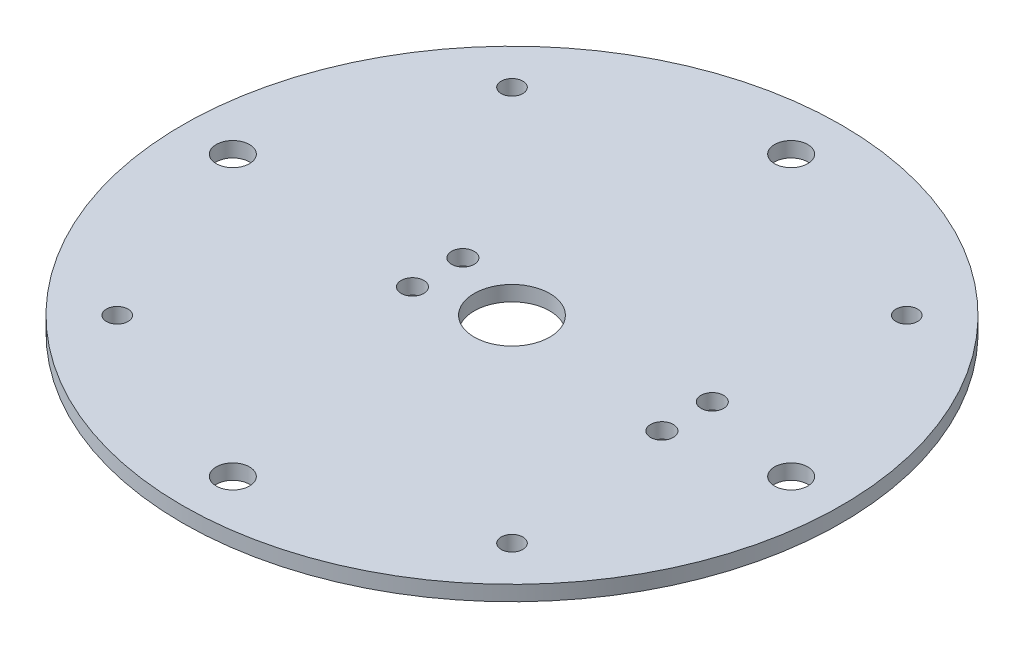
ISO-10303-21;
HEADER;
FILE_DESCRIPTION(('STEP AP214'),'2;1');
FILE_NAME('part.step','',(''),(''),'','','');
FILE_SCHEMA(('AUTOMOTIVE_DESIGN { 1 0 10303 214 1 1 1 1 }'));
ENDSEC;
DATA;
#1=APPLICATION_CONTEXT('core data for automotive mechanical design processes');
#2=APPLICATION_PROTOCOL_DEFINITION('international standard','automotive_design',2000,#1);
#3=PRODUCT_CONTEXT('',#1,'mechanical');
#4=PRODUCT('Part','Part','',(#3));
#5=PRODUCT_RELATED_PRODUCT_CATEGORY('part','',(#4));
#6=PRODUCT_DEFINITION_FORMATION('','',#4);
#7=PRODUCT_DEFINITION_CONTEXT('part definition',#1,'design');
#8=PRODUCT_DEFINITION('design','',#6,#7);
#9=PRODUCT_DEFINITION_SHAPE('','',#8);
#10=(LENGTH_UNIT() NAMED_UNIT(*) SI_UNIT(.MILLI.,.METRE.));
#11=(NAMED_UNIT(*) PLANE_ANGLE_UNIT() SI_UNIT($,.RADIAN.));
#12=(NAMED_UNIT(*) SI_UNIT($,.STERADIAN.) SOLID_ANGLE_UNIT());
#13=UNCERTAINTY_MEASURE_WITH_UNIT(LENGTH_MEASURE(1.E-05),#10,'distance_accuracy_value','');
#14=(GEOMETRIC_REPRESENTATION_CONTEXT(3) GLOBAL_UNCERTAINTY_ASSIGNED_CONTEXT((#13)) GLOBAL_UNIT_ASSIGNED_CONTEXT((#10,
#11,#12)) REPRESENTATION_CONTEXT('',''));
#15=CARTESIAN_POINT('',(0.,0.,0.));
#16=DIRECTION('',(0.,0.,1.));
#17=DIRECTION('',(1.,0.,0.));
#18=AXIS2_PLACEMENT_3D('',#15,#16,#17);
#19=CARTESIAN_POINT('',(0.,1.5,0.));
#20=DIRECTION('',(0.,-1.,0.));
#21=DIRECTION('',(0.,0.,-1.));
#22=AXIS2_PLACEMENT_3D('',#19,#20,#21);
#23=CYLINDRICAL_SURFACE('',#22,65.4);
#24=CARTESIAN_POINT('',(0.,1.5,0.));
#25=DIRECTION('',(0.,1.,0.));
#26=DIRECTION('',(0.,0.,1.));
#27=AXIS2_PLACEMENT_3D('',#24,#25,#26);
#28=CIRCLE('',#27,65.4);
#29=CARTESIAN_POINT('',(0.,1.5,65.4));
#30=VERTEX_POINT('',#29);
#31=EDGE_CURVE('E10',#30,#30,#28,.T.);
#32=ORIENTED_EDGE('',*,*,#31,.F.);
#33=EDGE_LOOP('',(#32));
#34=FACE_BOUND('',#33,.T.);
#35=CARTESIAN_POINT('',(0.,-1.5,0.));
#36=DIRECTION('',(0.,1.,0.));
#37=DIRECTION('',(0.,0.,1.));
#38=AXIS2_PLACEMENT_3D('',#35,#36,#37);
#39=CIRCLE('',#38,65.4);
#40=CARTESIAN_POINT('',(0.,-1.5,65.4));
#41=VERTEX_POINT('',#40);
#42=EDGE_CURVE('E37',#41,#41,#39,.T.);
#43=ORIENTED_EDGE('',*,*,#42,.T.);
#44=EDGE_LOOP('',(#43));
#45=FACE_BOUND('',#44,.T.);
#46=ADVANCED_FACE('F34',(#34,#45),#23,.T.);
#47=CARTESIAN_POINT('',(0.,1.5,0.));
#48=DIRECTION('',(0.,1.,0.));
#49=DIRECTION('',(0.,0.,1.));
#50=AXIS2_PLACEMENT_3D('',#47,#48,#49);
#51=PLANE('',#50);
#52=CARTESIAN_POINT('',(-14.75,1.5,5.00000000000002));
#53=DIRECTION('',(0.,-1.,0.));
#54=DIRECTION('',(0.,0.,-1.));
#55=AXIS2_PLACEMENT_3D('',#52,#53,#54);
#56=CIRCLE('',#55,2.25);
#57=CARTESIAN_POINT('',(-14.75,1.5,2.75000000000003));
#58=VERTEX_POINT('',#57);
#59=EDGE_CURVE('E113',#58,#58,#56,.T.);
#60=ORIENTED_EDGE('',*,*,#59,.T.);
#61=EDGE_LOOP('',(#60));
#62=FACE_BOUND('',#61,.T.);
#63=CARTESIAN_POINT('',(34.75,1.5,-4.99999999999999));
#64=DIRECTION('',(0.,-1.,0.));
#65=DIRECTION('',(0.,0.,-1.));
#66=AXIS2_PLACEMENT_3D('',#63,#64,#65);
#67=CIRCLE('',#66,2.25000000000001);
#68=CARTESIAN_POINT('',(34.75,1.5,-7.25));
#69=VERTEX_POINT('',#68);
#70=EDGE_CURVE('E106',#69,#69,#67,.T.);
#71=ORIENTED_EDGE('',*,*,#70,.T.);
#72=EDGE_LOOP('',(#71));
#73=FACE_BOUND('',#72,.T.);
#74=CARTESIAN_POINT('',(34.75,1.5,5.00000000000002));
#75=DIRECTION('',(0.,-1.,0.));
#76=DIRECTION('',(0.,0.,-1.));
#77=AXIS2_PLACEMENT_3D('',#74,#75,#76);
#78=CIRCLE('',#77,2.25);
#79=CARTESIAN_POINT('',(34.75,1.5,2.75000000000002));
#80=VERTEX_POINT('',#79);
#81=EDGE_CURVE('E118',#80,#80,#78,.T.);
#82=ORIENTED_EDGE('',*,*,#81,.T.);
#83=EDGE_LOOP('',(#82));
#84=FACE_BOUND('',#83,.T.);
#85=CARTESIAN_POINT('',(-14.75,1.5,-5.00000000000001));
#86=DIRECTION('',(0.,-1.,0.));
#87=DIRECTION('',(0.,0.,-1.));
#88=AXIS2_PLACEMENT_3D('',#85,#86,#87);
#89=CIRCLE('',#88,2.25);
#90=CARTESIAN_POINT('',(-14.75,1.5,-7.25));
#91=VERTEX_POINT('',#90);
#92=EDGE_CURVE('E97',#91,#91,#89,.T.);
#93=ORIENTED_EDGE('',*,*,#92,.T.);
#94=EDGE_LOOP('',(#93));
#95=FACE_BOUND('',#94,.T.);
#96=CARTESIAN_POINT('',(0.,1.5,0.));
#97=DIRECTION('',(0.,1.,0.));
#98=DIRECTION('',(0.,0.,1.));
#99=AXIS2_PLACEMENT_3D('',#96,#97,#98);
#100=CIRCLE('',#99,7.5);
#101=CARTESIAN_POINT('',(0.,1.5,7.5));
#102=VERTEX_POINT('',#101);
#103=EDGE_CURVE('E94',#102,#102,#100,.T.);
#104=ORIENTED_EDGE('',*,*,#103,.F.);
#105=EDGE_LOOP('',(#104));
#106=FACE_BOUND('',#105,.T.);
#107=CARTESIAN_POINT('',(-39.1737156777349,1.5,-39.1737156777345));
#108=DIRECTION('',(0.,1.,0.));
#109=DIRECTION('',(1.,0.,0.));
#110=AXIS2_PLACEMENT_3D('',#107,#108,#109);
#111=CIRCLE('',#110,2.15);
#112=CARTESIAN_POINT('',(-37.0237156777349,1.5,-39.1737156777345));
#113=VERTEX_POINT('',#112);
#114=EDGE_CURVE('E75',#113,#113,#111,.T.);
#115=ORIENTED_EDGE('',*,*,#114,.F.);
#116=EDGE_LOOP('',(#115));
#117=FACE_BOUND('',#116,.T.);
#118=CARTESIAN_POINT('',(-39.1737156777347,1.5,39.1737156777348));
#119=DIRECTION('',(0.,1.,0.));
#120=DIRECTION('',(0.,0.,-1.));
#121=AXIS2_PLACEMENT_3D('',#118,#119,#120);
#122=CIRCLE('',#121,2.15);
#123=CARTESIAN_POINT('',(-39.1737156777347,1.5,37.0237156777348));
#124=VERTEX_POINT('',#123);
#125=EDGE_CURVE('E84',#124,#124,#122,.T.);
#126=ORIENTED_EDGE('',*,*,#125,.F.);
#127=EDGE_LOOP('',(#126));
#128=FACE_BOUND('',#127,.T.);
#129=CARTESIAN_POINT('',(39.1737156777352,1.5,39.1737156777343));
#130=DIRECTION('',(0.,1.,0.));
#131=DIRECTION('',(-1.,0.,0.));
#132=AXIS2_PLACEMENT_3D('',#129,#130,#131);
#133=CIRCLE('',#132,2.15);
#134=CARTESIAN_POINT('',(37.0237156777352,1.5,39.1737156777343));
#135=VERTEX_POINT('',#134);
#136=EDGE_CURVE('E76',#135,#135,#133,.T.);
#137=ORIENTED_EDGE('',*,*,#136,.F.);
#138=EDGE_LOOP('',(#137));
#139=FACE_BOUND('',#138,.T.);
#140=CARTESIAN_POINT('',(39.1737156777347,1.5,-39.1737156777348));
#141=DIRECTION('',(0.,1.,0.));
#142=DIRECTION('',(0.,0.,1.));
#143=AXIS2_PLACEMENT_3D('',#140,#141,#142);
#144=CIRCLE('',#143,2.15);
#145=CARTESIAN_POINT('',(39.1737156777347,1.5,-37.0237156777348));
#146=VERTEX_POINT('',#145);
#147=EDGE_CURVE('E72',#146,#146,#144,.T.);
#148=ORIENTED_EDGE('',*,*,#147,.F.);
#149=EDGE_LOOP('',(#148));
#150=FACE_BOUND('',#149,.T.);
#151=CARTESIAN_POINT('',(-1.9342806617191E-13,1.5,-55.4));
#152=DIRECTION('',(0.,1.,0.));
#153=DIRECTION('',(1.,0.,0.));
#154=AXIS2_PLACEMENT_3D('',#151,#152,#153);
#155=CIRCLE('',#154,3.3);
#156=CARTESIAN_POINT('',(3.2999999999998,1.5,-55.4));
#157=VERTEX_POINT('',#156);
#158=EDGE_CURVE('E51',#157,#157,#155,.T.);
#159=ORIENTED_EDGE('',*,*,#158,.F.);
#160=EDGE_LOOP('',(#159));
#161=FACE_BOUND('',#160,.T.);
#162=CARTESIAN_POINT('',(-55.4,1.5,0.));
#163=DIRECTION('',(0.,1.,0.));
#164=DIRECTION('',(0.,0.,-1.));
#165=AXIS2_PLACEMENT_3D('',#162,#163,#164);
#166=CIRCLE('',#165,3.3);
#167=CARTESIAN_POINT('',(-55.4,1.5,-3.3));
#168=VERTEX_POINT('',#167);
#169=EDGE_CURVE('E60',#168,#168,#166,.T.);
#170=ORIENTED_EDGE('',*,*,#169,.F.);
#171=EDGE_LOOP('',(#170));
#172=FACE_BOUND('',#171,.T.);
#173=CARTESIAN_POINT('',(5.80284198515729E-13,1.5,55.4));
#174=DIRECTION('',(0.,1.,0.));
#175=DIRECTION('',(-1.,0.,0.));
#176=AXIS2_PLACEMENT_3D('',#173,#174,#175);
#177=CIRCLE('',#176,3.3);
#178=CARTESIAN_POINT('',(-3.29999999999942,1.5,55.4));
#179=VERTEX_POINT('',#178);
#180=EDGE_CURVE('E52',#179,#179,#177,.T.);
#181=ORIENTED_EDGE('',*,*,#180,.F.);
#182=EDGE_LOOP('',(#181));
#183=FACE_BOUND('',#182,.T.);
#184=CARTESIAN_POINT('',(55.4,1.5,0.));
#185=DIRECTION('',(0.,1.,0.));
#186=DIRECTION('',(0.,0.,1.));
#187=AXIS2_PLACEMENT_3D('',#184,#185,#186);
#188=CIRCLE('',#187,3.3);
#189=CARTESIAN_POINT('',(55.4,1.5,3.3));
#190=VERTEX_POINT('',#189);
#191=EDGE_CURVE('E48',#190,#190,#188,.T.);
#192=ORIENTED_EDGE('',*,*,#191,.F.);
#193=EDGE_LOOP('',(#192));
#194=FACE_BOUND('',#193,.T.);
#195=ORIENTED_EDGE('',*,*,#31,.T.);
#196=EDGE_LOOP('',(#195));
#197=FACE_BOUND('',#196,.T.);
#198=ADVANCED_FACE('F130',(#62,#73,#84,#95,#106,#117,#128,#139,#150,#161,#172,#183,#194,#197),
#51,.T.);
#199=CARTESIAN_POINT('',(0.,-1.5,0.));
#200=DIRECTION('',(0.,1.,0.));
#201=DIRECTION('',(0.,0.,1.));
#202=AXIS2_PLACEMENT_3D('',#199,#200,#201);
#203=PLANE('',#202);
#204=CARTESIAN_POINT('',(-14.75,-1.5,5.00000000000002));
#205=DIRECTION('',(0.,-1.,0.));
#206=DIRECTION('',(0.,0.,-1.));
#207=AXIS2_PLACEMENT_3D('',#204,#205,#206);
#208=CIRCLE('',#207,2.25);
#209=CARTESIAN_POINT('',(-14.75,-1.5,2.75000000000003));
#210=VERTEX_POINT('',#209);
#211=EDGE_CURVE('E103',#210,#210,#208,.T.);
#212=ORIENTED_EDGE('',*,*,#211,.F.);
#213=EDGE_LOOP('',(#212));
#214=FACE_BOUND('',#213,.T.);
#215=CARTESIAN_POINT('',(34.75,-1.5,-4.99999999999999));
#216=DIRECTION('',(0.,-1.,0.));
#217=DIRECTION('',(0.,0.,-1.));
#218=AXIS2_PLACEMENT_3D('',#215,#216,#217);
#219=CIRCLE('',#218,2.25000000000001);
#220=CARTESIAN_POINT('',(34.75,-1.5,-7.25));
#221=VERTEX_POINT('',#220);
#222=EDGE_CURVE('E109',#221,#221,#219,.T.);
#223=ORIENTED_EDGE('',*,*,#222,.F.);
#224=EDGE_LOOP('',(#223));
#225=FACE_BOUND('',#224,.T.);
#226=CARTESIAN_POINT('',(34.75,-1.5,5.00000000000002));
#227=DIRECTION('',(0.,-1.,0.));
#228=DIRECTION('',(0.,0.,-1.));
#229=AXIS2_PLACEMENT_3D('',#226,#227,#228);
#230=CIRCLE('',#229,2.25);
#231=CARTESIAN_POINT('',(34.75,-1.5,2.75000000000002));
#232=VERTEX_POINT('',#231);
#233=EDGE_CURVE('E110',#232,#232,#230,.T.);
#234=ORIENTED_EDGE('',*,*,#233,.F.);
#235=EDGE_LOOP('',(#234));
#236=FACE_BOUND('',#235,.T.);
#237=CARTESIAN_POINT('',(-14.75,-1.5,-5.00000000000001));
#238=DIRECTION('',(0.,-1.,0.));
#239=DIRECTION('',(0.,0.,-1.));
#240=AXIS2_PLACEMENT_3D('',#237,#238,#239);
#241=CIRCLE('',#240,2.25);
#242=CARTESIAN_POINT('',(-14.75,-1.5,-7.25));
#243=VERTEX_POINT('',#242);
#244=EDGE_CURVE('E100',#243,#243,#241,.T.);
#245=ORIENTED_EDGE('',*,*,#244,.F.);
#246=EDGE_LOOP('',(#245));
#247=FACE_BOUND('',#246,.T.);
#248=CARTESIAN_POINT('',(0.,-1.5,0.));
#249=DIRECTION('',(0.,1.,0.));
#250=DIRECTION('',(0.,0.,1.));
#251=AXIS2_PLACEMENT_3D('',#248,#249,#250);
#252=CIRCLE('',#251,7.5);
#253=CARTESIAN_POINT('',(0.,-1.5,7.5));
#254=VERTEX_POINT('',#253);
#255=EDGE_CURVE('E83',#254,#254,#252,.T.);
#256=ORIENTED_EDGE('',*,*,#255,.T.);
#257=EDGE_LOOP('',(#256));
#258=FACE_BOUND('',#257,.T.);
#259=CARTESIAN_POINT('',(-39.1737156777349,-1.5,-39.1737156777345));
#260=DIRECTION('',(0.,1.,0.));
#261=DIRECTION('',(1.,0.,0.));
#262=AXIS2_PLACEMENT_3D('',#259,#260,#261);
#263=CIRCLE('',#262,2.15);
#264=CARTESIAN_POINT('',(-37.0237156777349,-1.5,-39.1737156777345));
#265=VERTEX_POINT('',#264);
#266=EDGE_CURVE('E87',#265,#265,#263,.T.);
#267=ORIENTED_EDGE('',*,*,#266,.T.);
#268=EDGE_LOOP('',(#267));
#269=FACE_BOUND('',#268,.T.);
#270=CARTESIAN_POINT('',(-39.1737156777347,-1.5,39.1737156777348));
#271=DIRECTION('',(0.,1.,0.));
#272=DIRECTION('',(0.,0.,-1.));
#273=AXIS2_PLACEMENT_3D('',#270,#271,#272);
#274=CIRCLE('',#273,2.15);
#275=CARTESIAN_POINT('',(-39.1737156777347,-1.5,37.0237156777348));
#276=VERTEX_POINT('',#275);
#277=EDGE_CURVE('E79',#276,#276,#274,.T.);
#278=ORIENTED_EDGE('',*,*,#277,.T.);
#279=EDGE_LOOP('',(#278));
#280=FACE_BOUND('',#279,.T.);
#281=CARTESIAN_POINT('',(39.1737156777352,-1.5,39.1737156777343));
#282=DIRECTION('',(0.,1.,0.));
#283=DIRECTION('',(-1.,0.,0.));
#284=AXIS2_PLACEMENT_3D('',#281,#282,#283);
#285=CIRCLE('',#284,2.15);
#286=CARTESIAN_POINT('',(37.0237156777352,-1.5,39.1737156777343));
#287=VERTEX_POINT('',#286);
#288=EDGE_CURVE('E80',#287,#287,#285,.T.);
#289=ORIENTED_EDGE('',*,*,#288,.T.);
#290=EDGE_LOOP('',(#289));
#291=FACE_BOUND('',#290,.T.);
#292=CARTESIAN_POINT('',(39.1737156777347,-1.5,-39.1737156777348));
#293=DIRECTION('',(0.,1.,0.));
#294=DIRECTION('',(0.,0.,1.));
#295=AXIS2_PLACEMENT_3D('',#292,#293,#294);
#296=CIRCLE('',#295,2.15);
#297=CARTESIAN_POINT('',(39.1737156777347,-1.5,-37.0237156777348));
#298=VERTEX_POINT('',#297);
#299=EDGE_CURVE('E59',#298,#298,#296,.T.);
#300=ORIENTED_EDGE('',*,*,#299,.T.);
#301=EDGE_LOOP('',(#300));
#302=FACE_BOUND('',#301,.T.);
#303=CARTESIAN_POINT('',(-1.9342806617191E-13,-1.5,-55.4));
#304=DIRECTION('',(0.,1.,0.));
#305=DIRECTION('',(1.,0.,0.));
#306=AXIS2_PLACEMENT_3D('',#303,#304,#305);
#307=CIRCLE('',#306,3.3);
#308=CARTESIAN_POINT('',(3.2999999999998,-1.5,-55.4));
#309=VERTEX_POINT('',#308);
#310=EDGE_CURVE('E63',#309,#309,#307,.T.);
#311=ORIENTED_EDGE('',*,*,#310,.T.);
#312=EDGE_LOOP('',(#311));
#313=FACE_BOUND('',#312,.T.);
#314=CARTESIAN_POINT('',(-55.4,-1.5,0.));
#315=DIRECTION('',(0.,1.,0.));
#316=DIRECTION('',(0.,0.,-1.));
#317=AXIS2_PLACEMENT_3D('',#314,#315,#316);
#318=CIRCLE('',#317,3.3);
#319=CARTESIAN_POINT('',(-55.4,-1.5,-3.3));
#320=VERTEX_POINT('',#319);
#321=EDGE_CURVE('E55',#320,#320,#318,.T.);
#322=ORIENTED_EDGE('',*,*,#321,.T.);
#323=EDGE_LOOP('',(#322));
#324=FACE_BOUND('',#323,.T.);
#325=CARTESIAN_POINT('',(5.80284198515729E-13,-1.5,55.4));
#326=DIRECTION('',(0.,1.,0.));
#327=DIRECTION('',(-1.,0.,0.));
#328=AXIS2_PLACEMENT_3D('',#325,#326,#327);
#329=CIRCLE('',#328,3.3);
#330=CARTESIAN_POINT('',(-3.29999999999942,-1.5,55.4));
#331=VERTEX_POINT('',#330);
#332=EDGE_CURVE('E56',#331,#331,#329,.T.);
#333=ORIENTED_EDGE('',*,*,#332,.T.);
#334=EDGE_LOOP('',(#333));
#335=FACE_BOUND('',#334,.T.);
#336=CARTESIAN_POINT('',(55.4,-1.5,0.));
#337=DIRECTION('',(0.,1.,0.));
#338=DIRECTION('',(0.,0.,1.));
#339=AXIS2_PLACEMENT_3D('',#336,#337,#338);
#340=CIRCLE('',#339,3.3);
#341=CARTESIAN_POINT('',(55.4,-1.5,3.3));
#342=VERTEX_POINT('',#341);
#343=EDGE_CURVE('E44',#342,#342,#340,.T.);
#344=ORIENTED_EDGE('',*,*,#343,.T.);
#345=EDGE_LOOP('',(#344));
#346=FACE_BOUND('',#345,.T.);
#347=ORIENTED_EDGE('',*,*,#42,.F.);
#348=EDGE_LOOP('',(#347));
#349=FACE_BOUND('',#348,.T.);
#350=ADVANCED_FACE('F126',(#214,#225,#236,#247,#258,#269,#280,#291,#302,#313,#324,#335,#346,
#349),#203,.F.);
#351=CARTESIAN_POINT('',(55.4,1.5,0.));
#352=DIRECTION('',(0.,1.,0.));
#353=DIRECTION('',(0.,0.,1.));
#354=AXIS2_PLACEMENT_3D('',#351,#352,#353);
#355=CYLINDRICAL_SURFACE('',#354,3.3);
#356=ORIENTED_EDGE('',*,*,#343,.F.);
#357=EDGE_LOOP('',(#356));
#358=FACE_BOUND('',#357,.T.);
#359=ORIENTED_EDGE('',*,*,#191,.T.);
#360=EDGE_LOOP('',(#359));
#361=FACE_BOUND('',#360,.T.);
#362=ADVANCED_FACE('F129',(#358,#361),#355,.F.);
#363=CARTESIAN_POINT('',(5.80284198515729E-13,1.5,55.4));
#364=DIRECTION('',(0.,1.,0.));
#365=DIRECTION('',(-1.,0.,0.));
#366=AXIS2_PLACEMENT_3D('',#363,#364,#365);
#367=CYLINDRICAL_SURFACE('',#366,3.3);
#368=ORIENTED_EDGE('',*,*,#332,.F.);
#369=EDGE_LOOP('',(#368));
#370=FACE_BOUND('',#369,.T.);
#371=ORIENTED_EDGE('',*,*,#180,.T.);
#372=EDGE_LOOP('',(#371));
#373=FACE_BOUND('',#372,.T.);
#374=ADVANCED_FACE('F167',(#370,#373),#367,.F.);
#375=CARTESIAN_POINT('',(-55.4,1.5,0.));
#376=DIRECTION('',(0.,1.,0.));
#377=DIRECTION('',(0.,0.,-1.));
#378=AXIS2_PLACEMENT_3D('',#375,#376,#377);
#379=CYLINDRICAL_SURFACE('',#378,3.3);
#380=ORIENTED_EDGE('',*,*,#321,.F.);
#381=EDGE_LOOP('',(#380));
#382=FACE_BOUND('',#381,.T.);
#383=ORIENTED_EDGE('',*,*,#169,.T.);
#384=EDGE_LOOP('',(#383));
#385=FACE_BOUND('',#384,.T.);
#386=ADVANCED_FACE('F171',(#382,#385),#379,.F.);
#387=CARTESIAN_POINT('',(-1.9342806617191E-13,1.5,-55.4));
#388=DIRECTION('',(0.,1.,0.));
#389=DIRECTION('',(1.,0.,0.));
#390=AXIS2_PLACEMENT_3D('',#387,#388,#389);
#391=CYLINDRICAL_SURFACE('',#390,3.3);
#392=ORIENTED_EDGE('',*,*,#310,.F.);
#393=EDGE_LOOP('',(#392));
#394=FACE_BOUND('',#393,.T.);
#395=ORIENTED_EDGE('',*,*,#158,.T.);
#396=EDGE_LOOP('',(#395));
#397=FACE_BOUND('',#396,.T.);
#398=ADVANCED_FACE('F175',(#394,#397),#391,.F.);
#399=CARTESIAN_POINT('',(39.1737156777347,1.5,-39.1737156777348));
#400=DIRECTION('',(0.,1.,0.));
#401=DIRECTION('',(0.,0.,1.));
#402=AXIS2_PLACEMENT_3D('',#399,#400,#401);
#403=CYLINDRICAL_SURFACE('',#402,2.15);
#404=ORIENTED_EDGE('',*,*,#299,.F.);
#405=EDGE_LOOP('',(#404));
#406=FACE_BOUND('',#405,.T.);
#407=ORIENTED_EDGE('',*,*,#147,.T.);
#408=EDGE_LOOP('',(#407));
#409=FACE_BOUND('',#408,.T.);
#410=ADVANCED_FACE('F179',(#406,#409),#403,.F.);
#411=CARTESIAN_POINT('',(39.1737156777352,1.5,39.1737156777343));
#412=DIRECTION('',(0.,1.,0.));
#413=DIRECTION('',(-1.,0.,0.));
#414=AXIS2_PLACEMENT_3D('',#411,#412,#413);
#415=CYLINDRICAL_SURFACE('',#414,2.15);
#416=ORIENTED_EDGE('',*,*,#288,.F.);
#417=EDGE_LOOP('',(#416));
#418=FACE_BOUND('',#417,.T.);
#419=ORIENTED_EDGE('',*,*,#136,.T.);
#420=EDGE_LOOP('',(#419));
#421=FACE_BOUND('',#420,.T.);
#422=ADVANCED_FACE('F183',(#418,#421),#415,.F.);
#423=CARTESIAN_POINT('',(-39.1737156777347,1.5,39.1737156777348));
#424=DIRECTION('',(0.,1.,0.));
#425=DIRECTION('',(0.,0.,-1.));
#426=AXIS2_PLACEMENT_3D('',#423,#424,#425);
#427=CYLINDRICAL_SURFACE('',#426,2.15);
#428=ORIENTED_EDGE('',*,*,#277,.F.);
#429=EDGE_LOOP('',(#428));
#430=FACE_BOUND('',#429,.T.);
#431=ORIENTED_EDGE('',*,*,#125,.T.);
#432=EDGE_LOOP('',(#431));
#433=FACE_BOUND('',#432,.T.);
#434=ADVANCED_FACE('F187',(#430,#433),#427,.F.);
#435=CARTESIAN_POINT('',(-39.1737156777349,1.5,-39.1737156777345));
#436=DIRECTION('',(0.,1.,0.));
#437=DIRECTION('',(1.,0.,0.));
#438=AXIS2_PLACEMENT_3D('',#435,#436,#437);
#439=CYLINDRICAL_SURFACE('',#438,2.15);
#440=ORIENTED_EDGE('',*,*,#266,.F.);
#441=EDGE_LOOP('',(#440));
#442=FACE_BOUND('',#441,.T.);
#443=ORIENTED_EDGE('',*,*,#114,.T.);
#444=EDGE_LOOP('',(#443));
#445=FACE_BOUND('',#444,.T.);
#446=ADVANCED_FACE('F191',(#442,#445),#439,.F.);
#447=CARTESIAN_POINT('',(0.,-1.5,0.));
#448=DIRECTION('',(0.,1.,0.));
#449=DIRECTION('',(0.,0.,1.));
#450=AXIS2_PLACEMENT_3D('',#447,#448,#449);
#451=CYLINDRICAL_SURFACE('',#450,7.5);
#452=ORIENTED_EDGE('',*,*,#255,.F.);
#453=EDGE_LOOP('',(#452));
#454=FACE_BOUND('',#453,.T.);
#455=ORIENTED_EDGE('',*,*,#103,.T.);
#456=EDGE_LOOP('',(#455));
#457=FACE_BOUND('',#456,.T.);
#458=ADVANCED_FACE('F195',(#454,#457),#451,.F.);
#459=CARTESIAN_POINT('',(-14.75,1.5,-5.00000000000001));
#460=DIRECTION('',(0.,-1.,0.));
#461=DIRECTION('',(0.,0.,-1.));
#462=AXIS2_PLACEMENT_3D('',#459,#460,#461);
#463=CYLINDRICAL_SURFACE('',#462,2.25);
#464=ORIENTED_EDGE('',*,*,#92,.F.);
#465=EDGE_LOOP('',(#464));
#466=FACE_BOUND('',#465,.T.);
#467=ORIENTED_EDGE('',*,*,#244,.T.);
#468=EDGE_LOOP('',(#467));
#469=FACE_BOUND('',#468,.T.);
#470=ADVANCED_FACE('F199',(#466,#469),#463,.F.);
#471=CARTESIAN_POINT('',(34.75,1.5,5.00000000000002));
#472=DIRECTION('',(0.,-1.,0.));
#473=DIRECTION('',(0.,0.,-1.));
#474=AXIS2_PLACEMENT_3D('',#471,#472,#473);
#475=CYLINDRICAL_SURFACE('',#474,2.25);
#476=ORIENTED_EDGE('',*,*,#81,.F.);
#477=EDGE_LOOP('',(#476));
#478=FACE_BOUND('',#477,.T.);
#479=ORIENTED_EDGE('',*,*,#233,.T.);
#480=EDGE_LOOP('',(#479));
#481=FACE_BOUND('',#480,.T.);
#482=ADVANCED_FACE('F124',(#478,#481),#475,.F.);
#483=CARTESIAN_POINT('',(34.75,1.5,-4.99999999999999));
#484=DIRECTION('',(0.,-1.,0.));
#485=DIRECTION('',(0.,0.,-1.));
#486=AXIS2_PLACEMENT_3D('',#483,#484,#485);
#487=CYLINDRICAL_SURFACE('',#486,2.25000000000001);
#488=ORIENTED_EDGE('',*,*,#70,.F.);
#489=EDGE_LOOP('',(#488));
#490=FACE_BOUND('',#489,.T.);
#491=ORIENTED_EDGE('',*,*,#222,.T.);
#492=EDGE_LOOP('',(#491));
#493=FACE_BOUND('',#492,.T.);
#494=ADVANCED_FACE('F204',(#490,#493),#487,.F.);
#495=CARTESIAN_POINT('',(-14.75,1.5,5.00000000000002));
#496=DIRECTION('',(0.,-1.,0.));
#497=DIRECTION('',(0.,0.,-1.));
#498=AXIS2_PLACEMENT_3D('',#495,#496,#497);
#499=CYLINDRICAL_SURFACE('',#498,2.25);
#500=ORIENTED_EDGE('',*,*,#59,.F.);
#501=EDGE_LOOP('',(#500));
#502=FACE_BOUND('',#501,.T.);
#503=ORIENTED_EDGE('',*,*,#211,.T.);
#504=EDGE_LOOP('',(#503));
#505=FACE_BOUND('',#504,.T.);
#506=ADVANCED_FACE('F207',(#502,#505),#499,.F.);
#507=CLOSED_SHELL('',(#46,#198,#350,#362,#374,#386,#398,#410,#422,#434,#446,#458,#470,#482,#494,#506));
#508=MANIFOLD_SOLID_BREP('B2',#507);
#509=ADVANCED_BREP_SHAPE_REPRESENTATION('',(#18,#508),#14);
#510=SHAPE_DEFINITION_REPRESENTATION(#9,#509);
ENDSEC;
END-ISO-10303-21;
